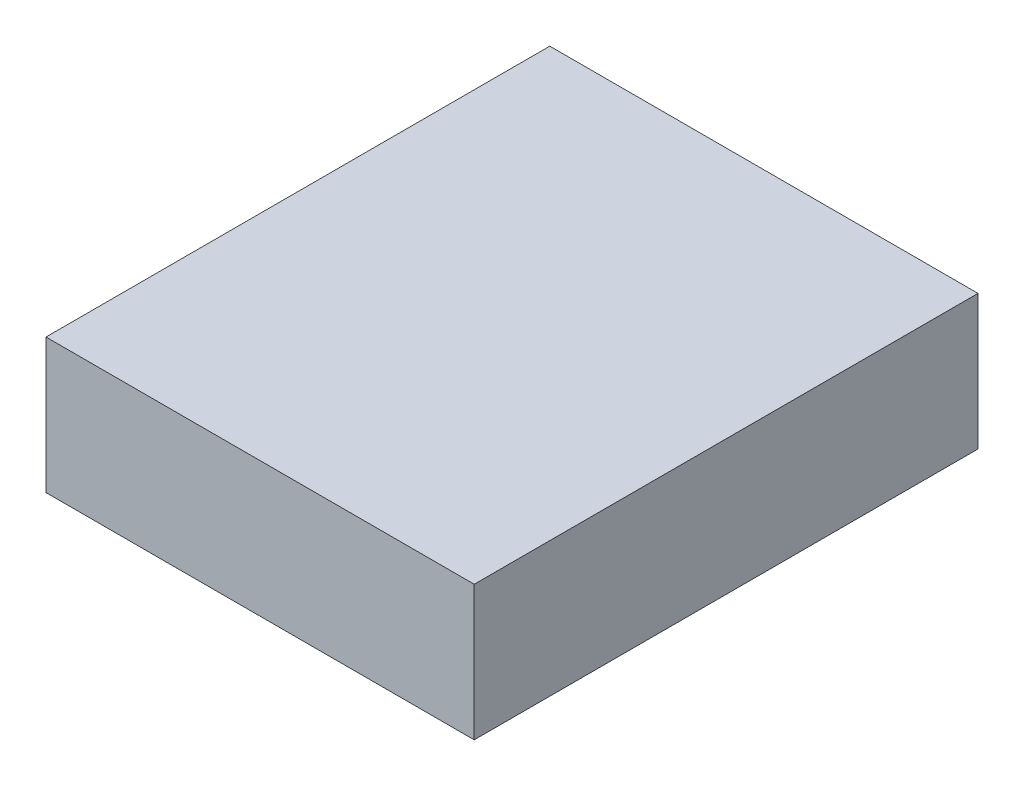
ISO-10303-21;
HEADER;
FILE_DESCRIPTION(('STEP AP214'),'2;1');
FILE_NAME('part.step','',(''),(''),'','','');
FILE_SCHEMA(('AUTOMOTIVE_DESIGN { 1 0 10303 214 1 1 1 1 }'));
ENDSEC;
DATA;
#1=APPLICATION_CONTEXT('core data for automotive mechanical design processes');
#2=APPLICATION_PROTOCOL_DEFINITION('international standard','automotive_design',2000,#1);
#3=PRODUCT_CONTEXT('',#1,'mechanical');
#4=PRODUCT('Part','Part','',(#3));
#5=PRODUCT_RELATED_PRODUCT_CATEGORY('part','',(#4));
#6=PRODUCT_DEFINITION_FORMATION('','',#4);
#7=PRODUCT_DEFINITION_CONTEXT('part definition',#1,'design');
#8=PRODUCT_DEFINITION('design','',#6,#7);
#9=PRODUCT_DEFINITION_SHAPE('','',#8);
#10=(LENGTH_UNIT() NAMED_UNIT(*) SI_UNIT(.MILLI.,.METRE.));
#11=(NAMED_UNIT(*) PLANE_ANGLE_UNIT() SI_UNIT($,.RADIAN.));
#12=(NAMED_UNIT(*) SI_UNIT($,.STERADIAN.) SOLID_ANGLE_UNIT());
#13=UNCERTAINTY_MEASURE_WITH_UNIT(LENGTH_MEASURE(1.E-05),#10,'distance_accuracy_value','');
#14=(GEOMETRIC_REPRESENTATION_CONTEXT(3) GLOBAL_UNCERTAINTY_ASSIGNED_CONTEXT((#13)) GLOBAL_UNIT_ASSIGNED_CONTEXT((#10,
#11,#12)) REPRESENTATION_CONTEXT('',''));
#15=CARTESIAN_POINT('',(0.,0.,0.));
#16=DIRECTION('',(0.,0.,1.));
#17=DIRECTION('',(1.,0.,0.));
#18=AXIS2_PLACEMENT_3D('',#15,#16,#17);
#19=CARTESIAN_POINT('',(17.,10.7,20.));
#20=DIRECTION('',(-1.,0.,0.));
#21=DIRECTION('',(0.,0.,1.));
#22=AXIS2_PLACEMENT_3D('',#19,#20,#21);
#23=PLANE('',#22);
#24=DIRECTION('',(0.,0.,-1.));
#25=VECTOR('',#24,1.);
#26=CARTESIAN_POINT('',(17.,0.,20.));
#27=LINE('',#26,#25);
#28=CARTESIAN_POINT('',(17.,0.,20.));
#29=VERTEX_POINT('',#28);
#30=CARTESIAN_POINT('',(17.,0.,-20.));
#31=VERTEX_POINT('',#30);
#32=EDGE_CURVE('E98',#29,#31,#27,.T.);
#33=ORIENTED_EDGE('',*,*,#32,.T.);
#34=DIRECTION('',(0.,-1.,0.));
#35=VECTOR('',#34,1.);
#36=CARTESIAN_POINT('',(17.,10.7,-20.));
#37=LINE('',#36,#35);
#38=CARTESIAN_POINT('',(17.,10.7,-20.));
#39=VERTEX_POINT('',#38);
#40=EDGE_CURVE('E11',#39,#31,#37,.T.);
#41=ORIENTED_EDGE('',*,*,#40,.F.);
#42=DIRECTION('',(0.,0.,-1.));
#43=VECTOR('',#42,1.);
#44=CARTESIAN_POINT('',(17.,10.7,20.));
#45=LINE('',#44,#43);
#46=CARTESIAN_POINT('',(17.,10.7,20.));
#47=VERTEX_POINT('',#46);
#48=EDGE_CURVE('E86',#47,#39,#45,.T.);
#49=ORIENTED_EDGE('',*,*,#48,.F.);
#50=DIRECTION('',(0.,-1.,0.));
#51=VECTOR('',#50,1.);
#52=CARTESIAN_POINT('',(17.,10.7,20.));
#53=LINE('',#52,#51);
#54=EDGE_CURVE('E94',#47,#29,#53,.T.);
#55=ORIENTED_EDGE('',*,*,#54,.T.);
#56=EDGE_LOOP('',(#33,#41,#49,#55));
#57=FACE_BOUND('',#56,.T.);
#58=ADVANCED_FACE('F35',(#57),#23,.F.);
#59=CARTESIAN_POINT('',(-17.,10.7,-20.));
#60=DIRECTION('',(0.,0.,1.));
#61=DIRECTION('',(1.,0.,0.));
#62=AXIS2_PLACEMENT_3D('',#59,#60,#61);
#63=PLANE('',#62);
#64=DIRECTION('',(-1.,0.,0.));
#65=VECTOR('',#64,1.);
#66=CARTESIAN_POINT('',(-17.,0.,-20.));
#67=LINE('',#66,#65);
#68=CARTESIAN_POINT('',(-17.,0.,-20.));
#69=VERTEX_POINT('',#68);
#70=EDGE_CURVE('E90',#31,#69,#67,.T.);
#71=ORIENTED_EDGE('',*,*,#70,.T.);
#72=DIRECTION('',(0.,-1.,0.));
#73=VECTOR('',#72,1.);
#74=CARTESIAN_POINT('',(-17.,10.7,-20.));
#75=LINE('',#74,#73);
#76=CARTESIAN_POINT('',(-17.,10.7,-20.));
#77=VERTEX_POINT('',#76);
#78=EDGE_CURVE('E43',#77,#69,#75,.T.);
#79=ORIENTED_EDGE('',*,*,#78,.F.);
#80=DIRECTION('',(-1.,0.,0.));
#81=VECTOR('',#80,1.);
#82=CARTESIAN_POINT('',(-17.,10.7,-20.));
#83=LINE('',#82,#81);
#84=EDGE_CURVE('E81',#39,#77,#83,.T.);
#85=ORIENTED_EDGE('',*,*,#84,.F.);
#86=ORIENTED_EDGE('',*,*,#40,.T.);
#87=EDGE_LOOP('',(#71,#79,#85,#86));
#88=FACE_BOUND('',#87,.T.);
#89=ADVANCED_FACE('F89',(#88),#63,.F.);
#90=CARTESIAN_POINT('',(-17.,10.7,20.));
#91=DIRECTION('',(1.,0.,0.));
#92=DIRECTION('',(0.,0.,-1.));
#93=AXIS2_PLACEMENT_3D('',#90,#91,#92);
#94=PLANE('',#93);
#95=DIRECTION('',(0.,0.,1.));
#96=VECTOR('',#95,1.);
#97=CARTESIAN_POINT('',(-17.,0.,20.));
#98=LINE('',#97,#96);
#99=CARTESIAN_POINT('',(-17.,0.,20.));
#100=VERTEX_POINT('',#99);
#101=EDGE_CURVE('E68',#69,#100,#98,.T.);
#102=ORIENTED_EDGE('',*,*,#101,.T.);
#103=DIRECTION('',(0.,-1.,0.));
#104=VECTOR('',#103,1.);
#105=CARTESIAN_POINT('',(-17.,10.7,20.));
#106=LINE('',#105,#104);
#107=CARTESIAN_POINT('',(-17.,10.7,20.));
#108=VERTEX_POINT('',#107);
#109=EDGE_CURVE('E91',#108,#100,#106,.T.);
#110=ORIENTED_EDGE('',*,*,#109,.F.);
#111=DIRECTION('',(0.,0.,1.));
#112=VECTOR('',#111,1.);
#113=CARTESIAN_POINT('',(-17.,10.7,20.));
#114=LINE('',#113,#112);
#115=EDGE_CURVE('E84',#77,#108,#114,.T.);
#116=ORIENTED_EDGE('',*,*,#115,.F.);
#117=ORIENTED_EDGE('',*,*,#78,.T.);
#118=EDGE_LOOP('',(#102,#110,#116,#117));
#119=FACE_BOUND('',#118,.T.);
#120=ADVANCED_FACE('F92',(#119),#94,.F.);
#121=CARTESIAN_POINT('',(-17.,10.7,20.));
#122=DIRECTION('',(0.,0.,-1.));
#123=DIRECTION('',(-1.,0.,0.));
#124=AXIS2_PLACEMENT_3D('',#121,#122,#123);
#125=PLANE('',#124);
#126=DIRECTION('',(1.,0.,0.));
#127=VECTOR('',#126,1.);
#128=CARTESIAN_POINT('',(-17.,0.,20.));
#129=LINE('',#128,#127);
#130=EDGE_CURVE('E74',#100,#29,#129,.T.);
#131=ORIENTED_EDGE('',*,*,#130,.T.);
#132=ORIENTED_EDGE('',*,*,#54,.F.);
#133=DIRECTION('',(1.,0.,0.));
#134=VECTOR('',#133,1.);
#135=CARTESIAN_POINT('',(-17.,10.7,20.));
#136=LINE('',#135,#134);
#137=EDGE_CURVE('E51',#108,#47,#136,.T.);
#138=ORIENTED_EDGE('',*,*,#137,.F.);
#139=ORIENTED_EDGE('',*,*,#109,.T.);
#140=EDGE_LOOP('',(#131,#132,#138,#139));
#141=FACE_BOUND('',#140,.T.);
#142=ADVANCED_FACE('F105',(#141),#125,.F.);
#143=CARTESIAN_POINT('',(0.,10.7,0.));
#144=DIRECTION('',(0.,-1.,0.));
#145=DIRECTION('',(0.,0.,-1.));
#146=AXIS2_PLACEMENT_3D('',#143,#144,#145);
#147=PLANE('',#146);
#148=ORIENTED_EDGE('',*,*,#48,.T.);
#149=ORIENTED_EDGE('',*,*,#84,.T.);
#150=ORIENTED_EDGE('',*,*,#115,.T.);
#151=ORIENTED_EDGE('',*,*,#137,.T.);
#152=EDGE_LOOP('',(#148,#149,#150,#151));
#153=FACE_BOUND('',#152,.T.);
#154=ADVANCED_FACE('F82',(#153),#147,.F.);
#155=CARTESIAN_POINT('',(0.,0.,0.));
#156=DIRECTION('',(0.,-1.,0.));
#157=DIRECTION('',(0.,0.,-1.));
#158=AXIS2_PLACEMENT_3D('',#155,#156,#157);
#159=PLANE('',#158);
#160=ORIENTED_EDGE('',*,*,#32,.F.);
#161=ORIENTED_EDGE('',*,*,#130,.F.);
#162=ORIENTED_EDGE('',*,*,#101,.F.);
#163=ORIENTED_EDGE('',*,*,#70,.F.);
#164=EDGE_LOOP('',(#160,#161,#162,#163));
#165=FACE_BOUND('',#164,.T.);
#166=ADVANCED_FACE('F108',(#165),#159,.T.);
#167=CLOSED_SHELL('',(#58,#89,#120,#142,#154,#166));
#168=MANIFOLD_SOLID_BREP('B2',#167);
#169=ADVANCED_BREP_SHAPE_REPRESENTATION('',(#18,#168),#14);
#170=SHAPE_DEFINITION_REPRESENTATION(#9,#169);
ENDSEC;
END-ISO-10303-21;
